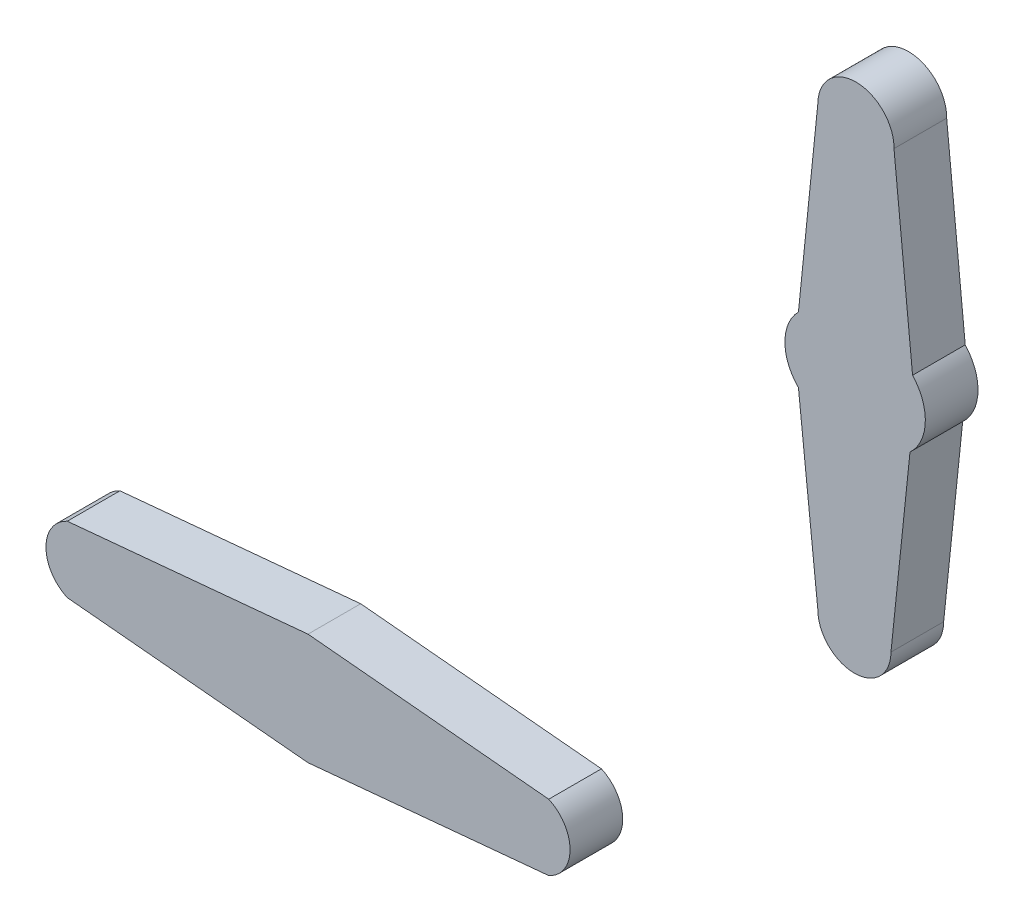
ISO-10303-21;
HEADER;
FILE_DESCRIPTION(('STEP AP214'),'2;1');
FILE_NAME('part.step','',(''),(''),'','','');
FILE_SCHEMA(('AUTOMOTIVE_DESIGN { 1 0 10303 214 1 1 1 1 }'));
ENDSEC;
DATA;
#1=APPLICATION_CONTEXT('core data for automotive mechanical design processes');
#2=APPLICATION_PROTOCOL_DEFINITION('international standard','automotive_design',2000,#1);
#3=PRODUCT_CONTEXT('',#1,'mechanical');
#4=PRODUCT('Part','Part','',(#3));
#5=PRODUCT_RELATED_PRODUCT_CATEGORY('part','',(#4));
#6=PRODUCT_DEFINITION_FORMATION('','',#4);
#7=PRODUCT_DEFINITION_CONTEXT('part definition',#1,'design');
#8=PRODUCT_DEFINITION('design','',#6,#7);
#9=PRODUCT_DEFINITION_SHAPE('','',#8);
#10=(LENGTH_UNIT() NAMED_UNIT(*) SI_UNIT(.MILLI.,.METRE.));
#11=(NAMED_UNIT(*) PLANE_ANGLE_UNIT() SI_UNIT($,.RADIAN.));
#12=(NAMED_UNIT(*) SI_UNIT($,.STERADIAN.) SOLID_ANGLE_UNIT());
#13=UNCERTAINTY_MEASURE_WITH_UNIT(LENGTH_MEASURE(1.E-05),#10,'distance_accuracy_value','');
#14=(GEOMETRIC_REPRESENTATION_CONTEXT(3) GLOBAL_UNCERTAINTY_ASSIGNED_CONTEXT((#13)) GLOBAL_UNIT_ASSIGNED_CONTEXT((#10,
#11,#12)) REPRESENTATION_CONTEXT('',''));
#15=CARTESIAN_POINT('',(0.,0.,0.));
#16=DIRECTION('',(0.,0.,1.));
#17=DIRECTION('',(1.,0.,0.));
#18=AXIS2_PLACEMENT_3D('',#15,#16,#17);
#19=CARTESIAN_POINT('',(0.,3.7,3.5));
#20=DIRECTION('',(-0.0933407086930577,-0.995634226059288,0.));
#21=DIRECTION('',(0.995634226059288,-0.0933407086930577,0.));
#22=AXIS2_PLACEMENT_3D('',#19,#20,#21);
#23=PLANE('',#22);
#24=DIRECTION('',(-0.995634226059288,0.0933407086930577,0.));
#25=VECTOR('',#24,1.);
#26=CARTESIAN_POINT('',(0.,3.7,0.));
#27=LINE('',#26,#25);
#28=CARTESIAN_POINT('',(16.,2.20000000000001,0.));
#29=VERTEX_POINT('',#28);
#30=CARTESIAN_POINT('',(0.,3.7,0.));
#31=VERTEX_POINT('',#30);
#32=EDGE_CURVE('E140',#29,#31,#27,.T.);
#33=ORIENTED_EDGE('',*,*,#32,.T.);
#34=DIRECTION('',(0.,0.,-1.));
#35=VECTOR('',#34,1.);
#36=CARTESIAN_POINT('',(0.,3.7,3.5));
#37=LINE('',#36,#35);
#38=CARTESIAN_POINT('',(0.,3.7,3.5));
#39=VERTEX_POINT('',#38);
#40=EDGE_CURVE('E12',#39,#31,#37,.T.);
#41=ORIENTED_EDGE('',*,*,#40,.F.);
#42=DIRECTION('',(-0.995634226059288,0.0933407086930577,0.));
#43=VECTOR('',#42,1.);
#44=CARTESIAN_POINT('',(0.,3.7,3.5));
#45=LINE('',#44,#43);
#46=CARTESIAN_POINT('',(16.,2.20000000000001,3.5));
#47=VERTEX_POINT('',#46);
#48=EDGE_CURVE('E156',#47,#39,#45,.T.);
#49=ORIENTED_EDGE('',*,*,#48,.F.);
#50=DIRECTION('',(0.,0.,-1.));
#51=VECTOR('',#50,1.);
#52=CARTESIAN_POINT('',(16.,2.20000000000001,3.5));
#53=LINE('',#52,#51);
#54=EDGE_CURVE('E136',#47,#29,#53,.T.);
#55=ORIENTED_EDGE('',*,*,#54,.T.);
#56=EDGE_LOOP('',(#33,#41,#49,#55));
#57=FACE_BOUND('',#56,.T.);
#58=ADVANCED_FACE('F51',(#57),#23,.F.);
#59=CARTESIAN_POINT('',(0.,3.7,3.5));
#60=DIRECTION('',(0.0933407086930583,-0.995634226059288,0.));
#61=DIRECTION('',(0.995634226059288,0.0933407086930583,0.));
#62=AXIS2_PLACEMENT_3D('',#59,#60,#61);
#63=PLANE('',#62);
#64=DIRECTION('',(-0.995634226059288,-0.0933407086930583,0.));
#65=VECTOR('',#64,1.);
#66=CARTESIAN_POINT('',(0.,3.7,0.));
#67=LINE('',#66,#65);
#68=CARTESIAN_POINT('',(-16.,2.2,0.));
#69=VERTEX_POINT('',#68);
#70=EDGE_CURVE('E144',#31,#69,#67,.T.);
#71=ORIENTED_EDGE('',*,*,#70,.T.);
#72=DIRECTION('',(0.,0.,-1.));
#73=VECTOR('',#72,1.);
#74=CARTESIAN_POINT('',(-16.,2.2,3.5));
#75=LINE('',#74,#73);
#76=CARTESIAN_POINT('',(-16.,2.2,3.5));
#77=VERTEX_POINT('',#76);
#78=EDGE_CURVE('E60',#77,#69,#75,.T.);
#79=ORIENTED_EDGE('',*,*,#78,.F.);
#80=DIRECTION('',(-0.995634226059288,-0.0933407086930583,0.));
#81=VECTOR('',#80,1.);
#82=CARTESIAN_POINT('',(0.,3.7,3.5));
#83=LINE('',#82,#81);
#84=EDGE_CURVE('E105',#39,#77,#83,.T.);
#85=ORIENTED_EDGE('',*,*,#84,.F.);
#86=ORIENTED_EDGE('',*,*,#40,.T.);
#87=EDGE_LOOP('',(#71,#79,#85,#86));
#88=FACE_BOUND('',#87,.T.);
#89=ADVANCED_FACE('F184',(#88),#63,.F.);
#90=CARTESIAN_POINT('',(-15.,0.,3.5));
#91=DIRECTION('',(0.,0.,-1.));
#92=DIRECTION('',(-1.,0.,0.));
#93=AXIS2_PLACEMENT_3D('',#90,#91,#92);
#94=CYLINDRICAL_SURFACE('',#93,2.41660919471891);
#95=CARTESIAN_POINT('',(-15.,0.,0.));
#96=DIRECTION('',(0.,0.,1.));
#97=DIRECTION('',(1.,0.,0.));
#98=AXIS2_PLACEMENT_3D('',#95,#96,#97);
#99=CIRCLE('',#98,2.41660919471891);
#100=CARTESIAN_POINT('',(-16.,-2.2,0.));
#101=VERTEX_POINT('',#100);
#102=EDGE_CURVE('E147',#69,#101,#99,.T.);
#103=ORIENTED_EDGE('',*,*,#102,.T.);
#104=DIRECTION('',(0.,0.,-1.));
#105=VECTOR('',#104,1.);
#106=CARTESIAN_POINT('',(-16.,-2.2,3.5));
#107=LINE('',#106,#105);
#108=CARTESIAN_POINT('',(-16.,-2.2,3.5));
#109=VERTEX_POINT('',#108);
#110=EDGE_CURVE('E129',#109,#101,#107,.T.);
#111=ORIENTED_EDGE('',*,*,#110,.F.);
#112=CARTESIAN_POINT('',(-15.,0.,3.5));
#113=DIRECTION('',(0.,0.,1.));
#114=DIRECTION('',(1.,0.,0.));
#115=AXIS2_PLACEMENT_3D('',#112,#113,#114);
#116=CIRCLE('',#115,2.41660919471891);
#117=EDGE_CURVE('E118',#77,#109,#116,.T.);
#118=ORIENTED_EDGE('',*,*,#117,.F.);
#119=ORIENTED_EDGE('',*,*,#78,.T.);
#120=EDGE_LOOP('',(#103,#111,#118,#119));
#121=FACE_BOUND('',#120,.T.);
#122=ADVANCED_FACE('F166',(#121),#94,.T.);
#123=CARTESIAN_POINT('',(-16.,-2.2,3.5));
#124=DIRECTION('',(0.0933407086930583,0.995634226059288,0.));
#125=DIRECTION('',(-0.995634226059288,0.0933407086930583,0.));
#126=AXIS2_PLACEMENT_3D('',#123,#124,#125);
#127=PLANE('',#126);
#128=DIRECTION('',(0.995634226059288,-0.0933407086930583,0.));
#129=VECTOR('',#128,1.);
#130=CARTESIAN_POINT('',(-16.,-2.2,0.));
#131=LINE('',#130,#129);
#132=CARTESIAN_POINT('',(0.,-3.7,0.));
#133=VERTEX_POINT('',#132);
#134=EDGE_CURVE('E127',#101,#133,#131,.T.);
#135=ORIENTED_EDGE('',*,*,#134,.T.);
#136=DIRECTION('',(0.,0.,-1.));
#137=VECTOR('',#136,1.);
#138=CARTESIAN_POINT('',(0.,-3.7,3.5));
#139=LINE('',#138,#137);
#140=CARTESIAN_POINT('',(0.,-3.7,3.5));
#141=VERTEX_POINT('',#140);
#142=EDGE_CURVE('E124',#141,#133,#139,.T.);
#143=ORIENTED_EDGE('',*,*,#142,.F.);
#144=DIRECTION('',(0.995634226059288,-0.0933407086930583,0.));
#145=VECTOR('',#144,1.);
#146=CARTESIAN_POINT('',(-16.,-2.2,3.5));
#147=LINE('',#146,#145);
#148=EDGE_CURVE('E112',#109,#141,#147,.T.);
#149=ORIENTED_EDGE('',*,*,#148,.F.);
#150=ORIENTED_EDGE('',*,*,#110,.T.);
#151=EDGE_LOOP('',(#135,#143,#149,#150));
#152=FACE_BOUND('',#151,.T.);
#153=ADVANCED_FACE('F125',(#152),#127,.F.);
#154=CARTESIAN_POINT('',(0.,-3.7,3.5));
#155=DIRECTION('',(-0.0934968576407259,0.995619574742939,0.));
#156=DIRECTION('',(-0.995619574742939,-0.0934968576407259,0.));
#157=AXIS2_PLACEMENT_3D('',#154,#155,#156);
#158=PLANE('',#157);
#159=DIRECTION('',(0.995619574742939,0.0934968576407259,0.));
#160=VECTOR('',#159,1.);
#161=CARTESIAN_POINT('',(0.,-3.7,0.));
#162=LINE('',#161,#160);
#163=CARTESIAN_POINT('',(16.,-2.19746855103983,0.));
#164=VERTEX_POINT('',#163);
#165=EDGE_CURVE('E91',#133,#164,#162,.T.);
#166=ORIENTED_EDGE('',*,*,#165,.T.);
#167=DIRECTION('',(0.,0.,-1.));
#168=VECTOR('',#167,1.);
#169=CARTESIAN_POINT('',(16.,-2.19746855103983,3.5));
#170=LINE('',#169,#168);
#171=CARTESIAN_POINT('',(16.,-2.19746855103983,3.5));
#172=VERTEX_POINT('',#171);
#173=EDGE_CURVE('E130',#172,#164,#170,.T.);
#174=ORIENTED_EDGE('',*,*,#173,.F.);
#175=DIRECTION('',(0.995619574742939,0.0934968576407259,0.));
#176=VECTOR('',#175,1.);
#177=CARTESIAN_POINT('',(0.,-3.7,3.5));
#178=LINE('',#177,#176);
#179=EDGE_CURVE('E116',#141,#172,#178,.T.);
#180=ORIENTED_EDGE('',*,*,#179,.F.);
#181=ORIENTED_EDGE('',*,*,#142,.T.);
#182=EDGE_LOOP('',(#166,#174,#180,#181));
#183=FACE_BOUND('',#182,.T.);
#184=ADVANCED_FACE('F132',(#183),#158,.F.);
#185=CARTESIAN_POINT('',(15.,0.00126572448008884,3.5));
#186=DIRECTION('',(0.,0.,-1.));
#187=DIRECTION('',(-1.,0.,0.));
#188=AXIS2_PLACEMENT_3D('',#185,#186,#187);
#189=CYLINDRICAL_SURFACE('',#188,2.41545697836788);
#190=CARTESIAN_POINT('',(15.,0.00126572448008884,0.));
#191=DIRECTION('',(0.,0.,1.));
#192=DIRECTION('',(-1.,0.,0.));
#193=AXIS2_PLACEMENT_3D('',#190,#191,#192);
#194=CIRCLE('',#193,2.41545697836788);
#195=EDGE_CURVE('E97',#164,#29,#194,.T.);
#196=ORIENTED_EDGE('',*,*,#195,.T.);
#197=ORIENTED_EDGE('',*,*,#54,.F.);
#198=CARTESIAN_POINT('',(15.,0.00126572448008884,3.5));
#199=DIRECTION('',(0.,0.,1.));
#200=DIRECTION('',(-1.,0.,0.));
#201=AXIS2_PLACEMENT_3D('',#198,#199,#200);
#202=CIRCLE('',#201,2.41545697836788);
#203=EDGE_CURVE('E68',#172,#47,#202,.T.);
#204=ORIENTED_EDGE('',*,*,#203,.F.);
#205=ORIENTED_EDGE('',*,*,#173,.T.);
#206=EDGE_LOOP('',(#196,#197,#204,#205));
#207=FACE_BOUND('',#206,.T.);
#208=ADVANCED_FACE('F173',(#207),#189,.T.);
#209=CARTESIAN_POINT('',(15.,0.00126572448008884,3.5));
#210=DIRECTION('',(0.,0.,-1.));
#211=DIRECTION('',(-1.,0.,0.));
#212=AXIS2_PLACEMENT_3D('',#209,#210,#211);
#213=PLANE('',#212);
#214=ORIENTED_EDGE('',*,*,#48,.T.);
#215=ORIENTED_EDGE('',*,*,#84,.T.);
#216=ORIENTED_EDGE('',*,*,#117,.T.);
#217=ORIENTED_EDGE('',*,*,#148,.T.);
#218=ORIENTED_EDGE('',*,*,#179,.T.);
#219=ORIENTED_EDGE('',*,*,#203,.T.);
#220=EDGE_LOOP('',(#214,#215,#216,#217,#218,#219));
#221=FACE_BOUND('',#220,.T.);
#222=ADVANCED_FACE('F114',(#221),#213,.F.);
#223=CARTESIAN_POINT('',(15.,0.00126572448008884,0.));
#224=DIRECTION('',(0.,0.,-1.));
#225=DIRECTION('',(-1.,0.,0.));
#226=AXIS2_PLACEMENT_3D('',#223,#224,#225);
#227=PLANE('',#226);
#228=ORIENTED_EDGE('',*,*,#32,.F.);
#229=ORIENTED_EDGE('',*,*,#195,.F.);
#230=ORIENTED_EDGE('',*,*,#165,.F.);
#231=ORIENTED_EDGE('',*,*,#134,.F.);
#232=ORIENTED_EDGE('',*,*,#102,.F.);
#233=ORIENTED_EDGE('',*,*,#70,.F.);
#234=EDGE_LOOP('',(#228,#229,#230,#231,#232,#233));
#235=FACE_BOUND('',#234,.T.);
#236=ADVANCED_FACE('F169',(#235),#227,.T.);
#237=CLOSED_SHELL('',(#58,#89,#122,#153,#184,#208,#222,#236));
#238=MANIFOLD_SOLID_BREP('B2',#237);
#239=CARTESIAN_POINT('',(34.7667287980849,36.3599974662066,3.5));
#240=DIRECTION('',(0.,0.,-1.));
#241=DIRECTION('',(-1.,0.,0.));
#242=AXIS2_PLACEMENT_3D('',#239,#240,#241);
#243=CYLINDRICAL_SURFACE('',#242,3.07477328372967);
#244=CARTESIAN_POINT('',(34.7667287980849,36.3599974662066,0.));
#245=DIRECTION('',(0.,0.,-1.));
#246=DIRECTION('',(1.,0.,0.));
#247=AXIS2_PLACEMENT_3D('',#244,#245,#246);
#248=CIRCLE('',#247,3.07477328372967);
#249=CARTESIAN_POINT('',(32.5925357585484,34.1858044266701,0.));
#250=VERTEX_POINT('',#249);
#251=CARTESIAN_POINT('',(32.5925357585484,38.534190505743,0.));
#252=VERTEX_POINT('',#251);
#253=EDGE_CURVE('E341',#250,#252,#248,.T.);
#254=ORIENTED_EDGE('',*,*,#253,.F.);
#255=DIRECTION('',(0.,0.,-1.));
#256=VECTOR('',#255,1.);
#257=CARTESIAN_POINT('',(32.5925357585484,34.1858044266701,3.5));
#258=LINE('',#257,#256);
#259=CARTESIAN_POINT('',(32.5925357585484,34.1858044266701,3.5));
#260=VERTEX_POINT('',#259);
#261=EDGE_CURVE('E49',#260,#250,#258,.T.);
#262=ORIENTED_EDGE('',*,*,#261,.F.);
#263=CARTESIAN_POINT('',(34.7667287980849,36.3599974662066,3.5));
#264=DIRECTION('',(0.,0.,-1.));
#265=DIRECTION('',(1.,0.,0.));
#266=AXIS2_PLACEMENT_3D('',#263,#264,#265);
#267=CIRCLE('',#266,3.07477328372967);
#268=CARTESIAN_POINT('',(32.5925357585484,38.534190505743,3.5));
#269=VERTEX_POINT('',#268);
#270=EDGE_CURVE('E361',#260,#269,#267,.T.);
#271=ORIENTED_EDGE('',*,*,#270,.T.);
#272=DIRECTION('',(0.,0.,-1.));
#273=VECTOR('',#272,1.);
#274=CARTESIAN_POINT('',(32.5925357585484,38.534190505743,3.5));
#275=LINE('',#274,#273);
#276=EDGE_CURVE('E247',#269,#252,#275,.T.);
#277=ORIENTED_EDGE('',*,*,#276,.T.);
#278=EDGE_LOOP('',(#254,#262,#271,#277));
#279=FACE_BOUND('',#278,.T.);
#280=ADVANCED_FACE('F244',(#279),#243,.T.);
#281=CARTESIAN_POINT('',(32.5925357585484,34.1858044266701,3.5));
#282=DIRECTION('',(-0.994405106691826,-0.105633724658453,0.));
#283=DIRECTION('',(0.105633724658453,-0.994405106691826,0.));
#284=AXIS2_PLACEMENT_3D('',#281,#282,#283);
#285=PLANE('',#284);
#286=DIRECTION('',(-0.105633724658453,0.994405106691826,0.));
#287=VECTOR('',#286,1.);
#288=CARTESIAN_POINT('',(32.5925357585484,34.1858044266701,0.));
#289=LINE('',#288,#287);
#290=CARTESIAN_POINT('',(33.8832190298321,22.03568816185,0.));
#291=VERTEX_POINT('',#290);
#292=EDGE_CURVE('E359',#291,#250,#289,.T.);
#293=ORIENTED_EDGE('',*,*,#292,.F.);
#294=DIRECTION('',(0.,0.,-1.));
#295=VECTOR('',#294,1.);
#296=CARTESIAN_POINT('',(33.8832190298321,22.03568816185,3.5));
#297=LINE('',#296,#295);
#298=CARTESIAN_POINT('',(33.8832190298321,22.03568816185,3.5));
#299=VERTEX_POINT('',#298);
#300=EDGE_CURVE('E253',#299,#291,#297,.T.);
#301=ORIENTED_EDGE('',*,*,#300,.F.);
#302=DIRECTION('',(-0.105633724658453,0.994405106691826,0.));
#303=VECTOR('',#302,1.);
#304=CARTESIAN_POINT('',(32.5925357585484,34.1858044266701,3.5));
#305=LINE('',#304,#303);
#306=EDGE_CURVE('E331',#299,#260,#305,.T.);
#307=ORIENTED_EDGE('',*,*,#306,.T.);
#308=ORIENTED_EDGE('',*,*,#261,.T.);
#309=EDGE_LOOP('',(#293,#301,#307,#308));
#310=FACE_BOUND('',#309,.T.);
#311=ADVANCED_FACE('F373',(#310),#285,.T.);
#312=CARTESIAN_POINT('',(36.3126891167961,22.03568816185,3.5));
#313=DIRECTION('',(0.,0.,-1.));
#314=DIRECTION('',(-1.,0.,0.));
#315=AXIS2_PLACEMENT_3D('',#312,#313,#314);
#316=CYLINDRICAL_SURFACE('',#315,2.42947008696399);
#317=CARTESIAN_POINT('',(36.3126891167961,22.03568816185,0.));
#318=DIRECTION('',(0.,0.,-1.));
#319=DIRECTION('',(1.,0.,0.));
#320=AXIS2_PLACEMENT_3D('',#317,#318,#319);
#321=CIRCLE('',#320,2.42947008696399);
#322=CARTESIAN_POINT('',(38.7421592037601,22.03568816185,0.));
#323=VERTEX_POINT('',#322);
#324=EDGE_CURVE('E318',#323,#291,#321,.T.);
#325=ORIENTED_EDGE('',*,*,#324,.F.);
#326=DIRECTION('',(0.,0.,-1.));
#327=VECTOR('',#326,1.);
#328=CARTESIAN_POINT('',(38.7421592037601,22.03568816185,3.5));
#329=LINE('',#328,#327);
#330=CARTESIAN_POINT('',(38.7421592037601,22.03568816185,3.5));
#331=VERTEX_POINT('',#330);
#332=EDGE_CURVE('E313',#331,#323,#329,.T.);
#333=ORIENTED_EDGE('',*,*,#332,.F.);
#334=CARTESIAN_POINT('',(36.3126891167961,22.03568816185,3.5));
#335=DIRECTION('',(0.,0.,-1.));
#336=DIRECTION('',(1.,0.,0.));
#337=AXIS2_PLACEMENT_3D('',#334,#335,#336);
#338=CIRCLE('',#337,2.42947008696399);
#339=EDGE_CURVE('E316',#331,#299,#338,.T.);
#340=ORIENTED_EDGE('',*,*,#339,.T.);
#341=ORIENTED_EDGE('',*,*,#300,.T.);
#342=EDGE_LOOP('',(#325,#333,#340,#341));
#343=FACE_BOUND('',#342,.T.);
#344=ADVANCED_FACE('F315',(#343),#316,.T.);
#345=CARTESIAN_POINT('',(40.0066652310323,34.1858044266701,3.5));
#346=DIRECTION('',(0.994627946173947,-0.10351448541048,0.));
#347=DIRECTION('',(0.10351448541048,0.994627946173947,0.));
#348=AXIS2_PLACEMENT_3D('',#345,#346,#347);
#349=PLANE('',#348);
#350=DIRECTION('',(-0.10351448541048,-0.994627946173947,0.));
#351=VECTOR('',#350,1.);
#352=CARTESIAN_POINT('',(40.0066652310323,34.1858044266701,0.));
#353=LINE('',#352,#351);
#354=CARTESIAN_POINT('',(40.0066652310323,34.1858044266701,0.));
#355=VERTEX_POINT('',#354);
#356=EDGE_CURVE('E356',#355,#323,#353,.T.);
#357=ORIENTED_EDGE('',*,*,#356,.F.);
#358=DIRECTION('',(0.,0.,-1.));
#359=VECTOR('',#358,1.);
#360=CARTESIAN_POINT('',(40.0066652310323,34.1858044266701,3.5));
#361=LINE('',#360,#359);
#362=CARTESIAN_POINT('',(40.0066652310323,34.1858044266701,3.5));
#363=VERTEX_POINT('',#362);
#364=EDGE_CURVE('E323',#363,#355,#361,.T.);
#365=ORIENTED_EDGE('',*,*,#364,.F.);
#366=DIRECTION('',(-0.10351448541048,-0.994627946173947,0.));
#367=VECTOR('',#366,1.);
#368=CARTESIAN_POINT('',(40.0066652310323,34.1858044266701,3.5));
#369=LINE('',#368,#367);
#370=EDGE_CURVE('E329',#363,#331,#369,.T.);
#371=ORIENTED_EDGE('',*,*,#370,.T.);
#372=ORIENTED_EDGE('',*,*,#332,.T.);
#373=EDGE_LOOP('',(#357,#365,#371,#372));
#374=FACE_BOUND('',#373,.T.);
#375=ADVANCED_FACE('F333',(#374),#349,.T.);
#376=CARTESIAN_POINT('',(37.8406600435749,36.5221642974102,3.5));
#377=DIRECTION('',(0.,0.,-1.));
#378=DIRECTION('',(-1.,0.,0.));
#379=AXIS2_PLACEMENT_3D('',#376,#377,#378);
#380=CYLINDRICAL_SURFACE('',#379,3.18593093423209);
#381=CARTESIAN_POINT('',(37.8406600435749,36.5221642974102,0.));
#382=DIRECTION('',(0.,0.,-1.));
#383=DIRECTION('',(-1.,0.,0.));
#384=AXIS2_PLACEMENT_3D('',#381,#382,#383);
#385=CIRCLE('',#384,3.18593093423209);
#386=CARTESIAN_POINT('',(40.177019914315,38.6881694848675,0.));
#387=VERTEX_POINT('',#386);
#388=EDGE_CURVE('E353',#387,#355,#385,.T.);
#389=ORIENTED_EDGE('',*,*,#388,.F.);
#390=DIRECTION('',(0.,0.,-1.));
#391=VECTOR('',#390,1.);
#392=CARTESIAN_POINT('',(40.177019914315,38.6881694848675,3.5));
#393=LINE('',#392,#391);
#394=CARTESIAN_POINT('',(40.177019914315,38.6881694848675,3.5));
#395=VERTEX_POINT('',#394);
#396=EDGE_CURVE('E365',#395,#387,#393,.T.);
#397=ORIENTED_EDGE('',*,*,#396,.F.);
#398=CARTESIAN_POINT('',(37.8406600435749,36.5221642974102,3.5));
#399=DIRECTION('',(0.,0.,-1.));
#400=DIRECTION('',(-1.,0.,0.));
#401=AXIS2_PLACEMENT_3D('',#398,#399,#400);
#402=CIRCLE('',#401,3.18593093423209);
#403=EDGE_CURVE('E334',#395,#363,#402,.T.);
#404=ORIENTED_EDGE('',*,*,#403,.T.);
#405=ORIENTED_EDGE('',*,*,#364,.T.);
#406=EDGE_LOOP('',(#389,#397,#404,#405));
#407=FACE_BOUND('',#406,.T.);
#408=ADVANCED_FACE('F386',(#407),#380,.T.);
#409=CARTESIAN_POINT('',(40.177019914315,38.6881694848675,3.5));
#410=DIRECTION('',(0.995109892439621,0.0987739943953172,0.));
#411=DIRECTION('',(-0.0987739943953172,0.995109892439621,0.));
#412=AXIS2_PLACEMENT_3D('',#409,#410,#411);
#413=PLANE('',#412);
#414=DIRECTION('',(0.0987739943953172,-0.995109892439621,0.));
#415=VECTOR('',#414,1.);
#416=CARTESIAN_POINT('',(40.177019914315,38.6881694848675,0.));
#417=LINE('',#416,#415);
#418=CARTESIAN_POINT('',(38.9434883234435,51.1155244402648,0.));
#419=VERTEX_POINT('',#418);
#420=EDGE_CURVE('E350',#419,#387,#417,.T.);
#421=ORIENTED_EDGE('',*,*,#420,.F.);
#422=DIRECTION('',(0.,0.,-1.));
#423=VECTOR('',#422,1.);
#424=CARTESIAN_POINT('',(38.9434883234435,51.1155244402648,3.5));
#425=LINE('',#424,#423);
#426=CARTESIAN_POINT('',(38.9434883234435,51.1155244402648,3.5));
#427=VERTEX_POINT('',#426);
#428=EDGE_CURVE('E367',#427,#419,#425,.T.);
#429=ORIENTED_EDGE('',*,*,#428,.F.);
#430=DIRECTION('',(0.0987739943953172,-0.995109892439621,0.));
#431=VECTOR('',#430,1.);
#432=CARTESIAN_POINT('',(40.177019914315,38.6881694848675,3.5));
#433=LINE('',#432,#431);
#434=EDGE_CURVE('E336',#427,#395,#433,.T.);
#435=ORIENTED_EDGE('',*,*,#434,.T.);
#436=ORIENTED_EDGE('',*,*,#396,.T.);
#437=EDGE_LOOP('',(#421,#429,#435,#436));
#438=FACE_BOUND('',#437,.T.);
#439=ADVANCED_FACE('F389',(#438),#413,.T.);
#440=CARTESIAN_POINT('',(36.4133536766378,51.1547813411832,3.5));
#441=DIRECTION('',(0.,0.,-1.));
#442=DIRECTION('',(-1.,0.,0.));
#443=AXIS2_PLACEMENT_3D('',#440,#441,#442);
#444=CYLINDRICAL_SURFACE('',#443,2.53043917833178);
#445=CARTESIAN_POINT('',(36.4133536766378,51.1547813411832,0.));
#446=DIRECTION('',(0.,0.,-1.));
#447=DIRECTION('',(1.,0.,0.));
#448=AXIS2_PLACEMENT_3D('',#445,#446,#447);
#449=CIRCLE('',#448,2.53043917833178);
#450=CARTESIAN_POINT('',(33.8832190298321,51.1940382421017,0.));
#451=VERTEX_POINT('',#450);
#452=EDGE_CURVE('E347',#451,#419,#449,.T.);
#453=ORIENTED_EDGE('',*,*,#452,.F.);
#454=DIRECTION('',(0.,0.,-1.));
#455=VECTOR('',#454,1.);
#456=CARTESIAN_POINT('',(33.8832190298321,51.1940382421017,3.5));
#457=LINE('',#456,#455);
#458=CARTESIAN_POINT('',(33.8832190298321,51.1940382421017,3.5));
#459=VERTEX_POINT('',#458);
#460=EDGE_CURVE('E368',#459,#451,#457,.T.);
#461=ORIENTED_EDGE('',*,*,#460,.F.);
#462=CARTESIAN_POINT('',(36.4133536766378,51.1547813411832,3.5));
#463=DIRECTION('',(0.,0.,-1.));
#464=DIRECTION('',(1.,0.,0.));
#465=AXIS2_PLACEMENT_3D('',#462,#463,#464);
#466=CIRCLE('',#465,2.53043917833178);
#467=EDGE_CURVE('E464',#459,#427,#466,.T.);
#468=ORIENTED_EDGE('',*,*,#467,.T.);
#469=ORIENTED_EDGE('',*,*,#428,.T.);
#470=EDGE_LOOP('',(#453,#461,#468,#469));
#471=FACE_BOUND('',#470,.T.);
#472=ADVANCED_FACE('F393',(#471),#444,.T.);
#473=CARTESIAN_POINT('',(32.5925357585484,38.534190505743,3.5));
#474=DIRECTION('',(-0.994843169173174,0.101425187944004,0.));
#475=DIRECTION('',(-0.101425187944004,-0.994843169173174,0.));
#476=AXIS2_PLACEMENT_3D('',#473,#474,#475);
#477=PLANE('',#476);
#478=DIRECTION('',(0.101425187944004,0.994843169173173,0.));
#479=VECTOR('',#478,1.);
#480=CARTESIAN_POINT('',(32.5925357585484,38.534190505743,0.));
#481=LINE('',#480,#479);
#482=EDGE_CURVE('E344',#252,#451,#481,.T.);
#483=ORIENTED_EDGE('',*,*,#482,.F.);
#484=ORIENTED_EDGE('',*,*,#276,.F.);
#485=DIRECTION('',(0.101425187944004,0.994843169173173,0.));
#486=VECTOR('',#485,1.);
#487=CARTESIAN_POINT('',(32.5925357585484,38.534190505743,3.5));
#488=LINE('',#487,#486);
#489=EDGE_CURVE('E465',#269,#459,#488,.T.);
#490=ORIENTED_EDGE('',*,*,#489,.T.);
#491=ORIENTED_EDGE('',*,*,#460,.T.);
#492=EDGE_LOOP('',(#483,#484,#490,#491));
#493=FACE_BOUND('',#492,.T.);
#494=ADVANCED_FACE('F370',(#493),#477,.T.);
#495=CARTESIAN_POINT('',(34.7667287980849,36.3599974662066,3.5));
#496=DIRECTION('',(0.,0.,1.));
#497=DIRECTION('',(1.,0.,0.));
#498=AXIS2_PLACEMENT_3D('',#495,#496,#497);
#499=PLANE('',#498);
#500=ORIENTED_EDGE('',*,*,#270,.F.);
#501=ORIENTED_EDGE('',*,*,#306,.F.);
#502=ORIENTED_EDGE('',*,*,#339,.F.);
#503=ORIENTED_EDGE('',*,*,#370,.F.);
#504=ORIENTED_EDGE('',*,*,#403,.F.);
#505=ORIENTED_EDGE('',*,*,#434,.F.);
#506=ORIENTED_EDGE('',*,*,#467,.F.);
#507=ORIENTED_EDGE('',*,*,#489,.F.);
#508=EDGE_LOOP('',(#500,#501,#502,#503,#504,#505,#506,#507));
#509=FACE_BOUND('',#508,.T.);
#510=ADVANCED_FACE('F327',(#509),#499,.T.);
#511=CARTESIAN_POINT('',(34.7667287980849,36.3599974662066,0.));
#512=DIRECTION('',(0.,0.,1.));
#513=DIRECTION('',(1.,0.,0.));
#514=AXIS2_PLACEMENT_3D('',#511,#512,#513);
#515=PLANE('',#514);
#516=ORIENTED_EDGE('',*,*,#253,.T.);
#517=ORIENTED_EDGE('',*,*,#482,.T.);
#518=ORIENTED_EDGE('',*,*,#452,.T.);
#519=ORIENTED_EDGE('',*,*,#420,.T.);
#520=ORIENTED_EDGE('',*,*,#388,.T.);
#521=ORIENTED_EDGE('',*,*,#356,.T.);
#522=ORIENTED_EDGE('',*,*,#324,.T.);
#523=ORIENTED_EDGE('',*,*,#292,.T.);
#524=EDGE_LOOP('',(#516,#517,#518,#519,#520,#521,#522,#523));
#525=FACE_BOUND('',#524,.T.);
#526=ADVANCED_FACE('F372',(#525),#515,.F.);
#527=CLOSED_SHELL('',(#280,#311,#344,#375,#408,#439,#472,#494,#510,#526));
#528=MANIFOLD_SOLID_BREP('B6_NOT_SHOWN',#527);
#529=ADVANCED_BREP_SHAPE_REPRESENTATION('',(#18,#238,#528),#14);
#530=SHAPE_DEFINITION_REPRESENTATION(#9,#529);
ENDSEC;
END-ISO-10303-21;
